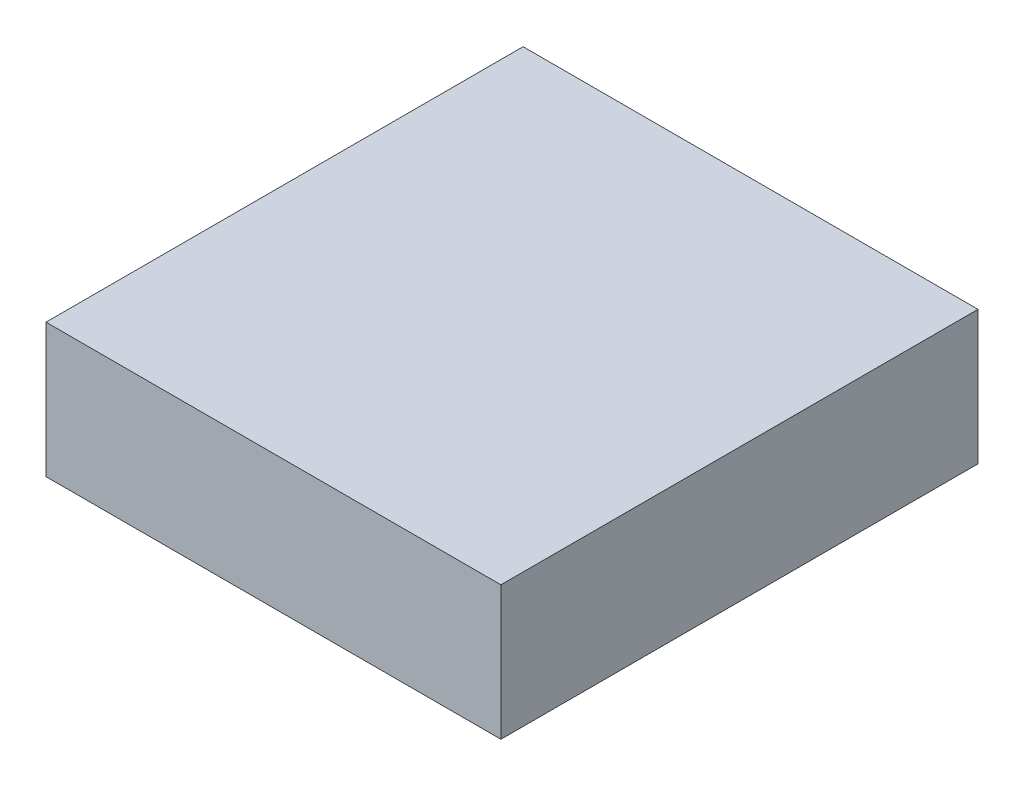
ISO-10303-21;
HEADER;
FILE_DESCRIPTION(('STEP AP214'),'2;1');
FILE_NAME('part.step','',(''),(''),'','','');
FILE_SCHEMA(('AUTOMOTIVE_DESIGN { 1 0 10303 214 1 1 1 1 }'));
ENDSEC;
DATA;
#1=APPLICATION_CONTEXT('core data for automotive mechanical design processes');
#2=APPLICATION_PROTOCOL_DEFINITION('international standard','automotive_design',2000,#1);
#3=PRODUCT_CONTEXT('',#1,'mechanical');
#4=PRODUCT('Part','Part','',(#3));
#5=PRODUCT_RELATED_PRODUCT_CATEGORY('part','',(#4));
#6=PRODUCT_DEFINITION_FORMATION('','',#4);
#7=PRODUCT_DEFINITION_CONTEXT('part definition',#1,'design');
#8=PRODUCT_DEFINITION('design','',#6,#7);
#9=PRODUCT_DEFINITION_SHAPE('','',#8);
#10=(LENGTH_UNIT() NAMED_UNIT(*) SI_UNIT(.MILLI.,.METRE.));
#11=(NAMED_UNIT(*) PLANE_ANGLE_UNIT() SI_UNIT($,.RADIAN.));
#12=(NAMED_UNIT(*) SI_UNIT($,.STERADIAN.) SOLID_ANGLE_UNIT());
#13=UNCERTAINTY_MEASURE_WITH_UNIT(LENGTH_MEASURE(1.E-05),#10,'distance_accuracy_value','');
#14=(GEOMETRIC_REPRESENTATION_CONTEXT(3) GLOBAL_UNCERTAINTY_ASSIGNED_CONTEXT((#13)) GLOBAL_UNIT_ASSIGNED_CONTEXT((#10,
#11,#12)) REPRESENTATION_CONTEXT('',''));
#15=CARTESIAN_POINT('',(0.,0.,0.));
#16=DIRECTION('',(0.,0.,1.));
#17=DIRECTION('',(1.,0.,0.));
#18=AXIS2_PLACEMENT_3D('',#15,#16,#17);
#19=CARTESIAN_POINT('',(32.3,19.,33.875));
#20=DIRECTION('',(-1.,0.,0.));
#21=DIRECTION('',(0.,0.,1.));
#22=AXIS2_PLACEMENT_3D('',#19,#20,#21);
#23=PLANE('',#22);
#24=DIRECTION('',(0.,0.,-1.));
#25=VECTOR('',#24,1.);
#26=CARTESIAN_POINT('',(32.3,0.,33.875));
#27=LINE('',#26,#25);
#28=CARTESIAN_POINT('',(32.3,0.,33.875));
#29=VERTEX_POINT('',#28);
#30=CARTESIAN_POINT('',(32.3,0.,-33.875));
#31=VERTEX_POINT('',#30);
#32=EDGE_CURVE('E111',#29,#31,#27,.T.);
#33=ORIENTED_EDGE('',*,*,#32,.T.);
#34=DIRECTION('',(0.,-1.,0.));
#35=VECTOR('',#34,1.);
#36=CARTESIAN_POINT('',(32.3,19.,-33.875));
#37=LINE('',#36,#35);
#38=CARTESIAN_POINT('',(32.3,19.,-33.875));
#39=VERTEX_POINT('',#38);
#40=EDGE_CURVE('E11',#39,#31,#37,.T.);
#41=ORIENTED_EDGE('',*,*,#40,.F.);
#42=DIRECTION('',(0.,0.,-1.));
#43=VECTOR('',#42,1.);
#44=CARTESIAN_POINT('',(32.3,19.,33.875));
#45=LINE('',#44,#43);
#46=CARTESIAN_POINT('',(32.3,19.,33.875));
#47=VERTEX_POINT('',#46);
#48=EDGE_CURVE('E95',#47,#39,#45,.T.);
#49=ORIENTED_EDGE('',*,*,#48,.F.);
#50=DIRECTION('',(0.,-1.,0.));
#51=VECTOR('',#50,1.);
#52=CARTESIAN_POINT('',(32.3,19.,33.875));
#53=LINE('',#52,#51);
#54=EDGE_CURVE('E107',#47,#29,#53,.T.);
#55=ORIENTED_EDGE('',*,*,#54,.T.);
#56=EDGE_LOOP('',(#33,#41,#49,#55));
#57=FACE_BOUND('',#56,.T.);
#58=ADVANCED_FACE('F43',(#57),#23,.F.);
#59=CARTESIAN_POINT('',(-32.3,19.,-33.875));
#60=DIRECTION('',(0.,0.,1.));
#61=DIRECTION('',(1.,0.,0.));
#62=AXIS2_PLACEMENT_3D('',#59,#60,#61);
#63=PLANE('',#62);
#64=DIRECTION('',(-1.,0.,0.));
#65=VECTOR('',#64,1.);
#66=CARTESIAN_POINT('',(-32.3,0.,-33.875));
#67=LINE('',#66,#65);
#68=CARTESIAN_POINT('',(-32.3,0.,-33.875));
#69=VERTEX_POINT('',#68);
#70=EDGE_CURVE('E100',#31,#69,#67,.T.);
#71=ORIENTED_EDGE('',*,*,#70,.T.);
#72=DIRECTION('',(0.,-1.,0.));
#73=VECTOR('',#72,1.);
#74=CARTESIAN_POINT('',(-32.3,19.,-33.875));
#75=LINE('',#74,#73);
#76=CARTESIAN_POINT('',(-32.3,19.,-33.875));
#77=VERTEX_POINT('',#76);
#78=EDGE_CURVE('E52',#77,#69,#75,.T.);
#79=ORIENTED_EDGE('',*,*,#78,.F.);
#80=DIRECTION('',(-1.,0.,0.));
#81=VECTOR('',#80,1.);
#82=CARTESIAN_POINT('',(-32.3,19.,-33.875));
#83=LINE('',#82,#81);
#84=EDGE_CURVE('E90',#39,#77,#83,.T.);
#85=ORIENTED_EDGE('',*,*,#84,.F.);
#86=ORIENTED_EDGE('',*,*,#40,.T.);
#87=EDGE_LOOP('',(#71,#79,#85,#86));
#88=FACE_BOUND('',#87,.T.);
#89=ADVANCED_FACE('F99',(#88),#63,.F.);
#90=CARTESIAN_POINT('',(-32.3,19.,33.875));
#91=DIRECTION('',(1.,0.,0.));
#92=DIRECTION('',(0.,0.,-1.));
#93=AXIS2_PLACEMENT_3D('',#90,#91,#92);
#94=PLANE('',#93);
#95=DIRECTION('',(0.,0.,1.));
#96=VECTOR('',#95,1.);
#97=CARTESIAN_POINT('',(-32.3,0.,33.875));
#98=LINE('',#97,#96);
#99=CARTESIAN_POINT('',(-32.3,0.,33.875));
#100=VERTEX_POINT('',#99);
#101=EDGE_CURVE('E77',#69,#100,#98,.T.);
#102=ORIENTED_EDGE('',*,*,#101,.T.);
#103=DIRECTION('',(0.,-1.,0.));
#104=VECTOR('',#103,1.);
#105=CARTESIAN_POINT('',(-32.3,19.,33.875));
#106=LINE('',#105,#104);
#107=CARTESIAN_POINT('',(-32.3,19.,33.875));
#108=VERTEX_POINT('',#107);
#109=EDGE_CURVE('E102',#108,#100,#106,.T.);
#110=ORIENTED_EDGE('',*,*,#109,.F.);
#111=DIRECTION('',(0.,0.,1.));
#112=VECTOR('',#111,1.);
#113=CARTESIAN_POINT('',(-32.3,19.,33.875));
#114=LINE('',#113,#112);
#115=EDGE_CURVE('E93',#77,#108,#114,.T.);
#116=ORIENTED_EDGE('',*,*,#115,.F.);
#117=ORIENTED_EDGE('',*,*,#78,.T.);
#118=EDGE_LOOP('',(#102,#110,#116,#117));
#119=FACE_BOUND('',#118,.T.);
#120=ADVANCED_FACE('F103',(#119),#94,.F.);
#121=CARTESIAN_POINT('',(-32.3,19.,33.875));
#122=DIRECTION('',(0.,0.,-1.));
#123=DIRECTION('',(-1.,0.,0.));
#124=AXIS2_PLACEMENT_3D('',#121,#122,#123);
#125=PLANE('',#124);
#126=DIRECTION('',(1.,0.,0.));
#127=VECTOR('',#126,1.);
#128=CARTESIAN_POINT('',(-32.3,0.,33.875));
#129=LINE('',#128,#127);
#130=EDGE_CURVE('E83',#100,#29,#129,.T.);
#131=ORIENTED_EDGE('',*,*,#130,.T.);
#132=ORIENTED_EDGE('',*,*,#54,.F.);
#133=DIRECTION('',(1.,0.,0.));
#134=VECTOR('',#133,1.);
#135=CARTESIAN_POINT('',(-32.3,19.,33.875));
#136=LINE('',#135,#134);
#137=EDGE_CURVE('E60',#108,#47,#136,.T.);
#138=ORIENTED_EDGE('',*,*,#137,.F.);
#139=ORIENTED_EDGE('',*,*,#109,.T.);
#140=EDGE_LOOP('',(#131,#132,#138,#139));
#141=FACE_BOUND('',#140,.T.);
#142=ADVANCED_FACE('F124',(#141),#125,.F.);
#143=CARTESIAN_POINT('',(0.,19.,0.));
#144=DIRECTION('',(0.,-1.,0.));
#145=DIRECTION('',(0.,0.,-1.));
#146=AXIS2_PLACEMENT_3D('',#143,#144,#145);
#147=PLANE('',#146);
#148=ORIENTED_EDGE('',*,*,#48,.T.);
#149=ORIENTED_EDGE('',*,*,#84,.T.);
#150=ORIENTED_EDGE('',*,*,#115,.T.);
#151=ORIENTED_EDGE('',*,*,#137,.T.);
#152=EDGE_LOOP('',(#148,#149,#150,#151));
#153=FACE_BOUND('',#152,.T.);
#154=ADVANCED_FACE('F91',(#153),#147,.F.);
#155=CARTESIAN_POINT('',(0.,0.,0.));
#156=DIRECTION('',(0.,-1.,0.));
#157=DIRECTION('',(0.,0.,-1.));
#158=AXIS2_PLACEMENT_3D('',#155,#156,#157);
#159=PLANE('',#158);
#160=ORIENTED_EDGE('',*,*,#32,.F.);
#161=ORIENTED_EDGE('',*,*,#130,.F.);
#162=ORIENTED_EDGE('',*,*,#101,.F.);
#163=ORIENTED_EDGE('',*,*,#70,.F.);
#164=EDGE_LOOP('',(#160,#161,#162,#163));
#165=FACE_BOUND('',#164,.T.);
#166=ADVANCED_FACE('F127',(#165),#159,.T.);
#167=CLOSED_SHELL('',(#58,#89,#120,#142,#154,#166));
#168=MANIFOLD_SOLID_BREP('B2',#167);
#169=ADVANCED_BREP_SHAPE_REPRESENTATION('',(#18,#168),#14);
#170=SHAPE_DEFINITION_REPRESENTATION(#9,#169);
ENDSEC;
END-ISO-10303-21;
